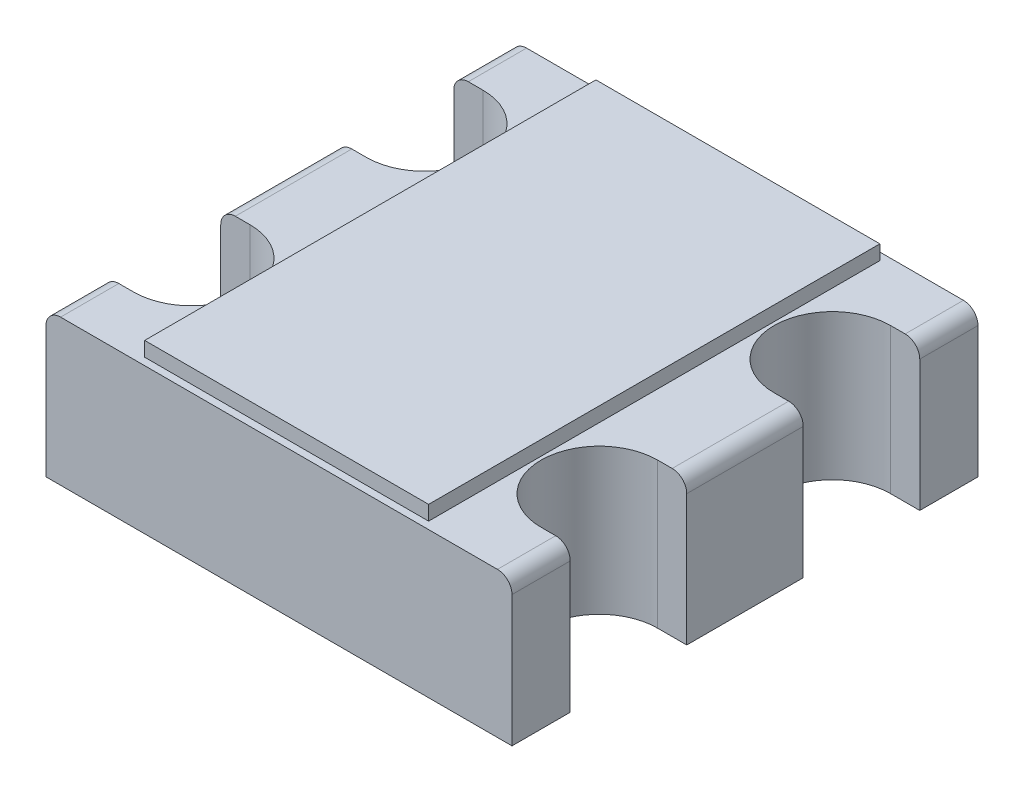
ISO-10303-21;
HEADER;
FILE_DESCRIPTION(('STEP AP214'),'2;1');
FILE_NAME('part.step','',(''),(''),'','','');
FILE_SCHEMA(('AUTOMOTIVE_DESIGN { 1 0 10303 214 1 1 1 1 }'));
ENDSEC;
DATA;
#1=APPLICATION_CONTEXT('core data for automotive mechanical design processes');
#2=APPLICATION_PROTOCOL_DEFINITION('international standard','automotive_design',2000,#1);
#3=PRODUCT_CONTEXT('',#1,'mechanical');
#4=PRODUCT('Part','Part','',(#3));
#5=PRODUCT_RELATED_PRODUCT_CATEGORY('part','',(#4));
#6=PRODUCT_DEFINITION_FORMATION('','',#4);
#7=PRODUCT_DEFINITION_CONTEXT('part definition',#1,'design');
#8=PRODUCT_DEFINITION('design','',#6,#7);
#9=PRODUCT_DEFINITION_SHAPE('','',#8);
#10=(LENGTH_UNIT() NAMED_UNIT(*) SI_UNIT(.MILLI.,.METRE.));
#11=(NAMED_UNIT(*) PLANE_ANGLE_UNIT() SI_UNIT($,.RADIAN.));
#12=(NAMED_UNIT(*) SI_UNIT($,.STERADIAN.) SOLID_ANGLE_UNIT());
#13=UNCERTAINTY_MEASURE_WITH_UNIT(LENGTH_MEASURE(1.E-05),#10,'distance_accuracy_value','');
#14=(GEOMETRIC_REPRESENTATION_CONTEXT(3) GLOBAL_UNCERTAINTY_ASSIGNED_CONTEXT((#13)) GLOBAL_UNIT_ASSIGNED_CONTEXT((#10,
#11,#12)) REPRESENTATION_CONTEXT('',''));
#15=CARTESIAN_POINT('',(0.,0.,0.));
#16=DIRECTION('',(0.,0.,1.));
#17=DIRECTION('',(1.,0.,0.));
#18=AXIS2_PLACEMENT_3D('',#15,#16,#17);
#19=CARTESIAN_POINT('',(-0.8,0.5,-0.8));
#20=DIRECTION('',(0.,0.,1.));
#21=DIRECTION('',(1.,0.,0.));
#22=AXIS2_PLACEMENT_3D('',#19,#20,#21);
#23=PLANE('',#22);
#24=DIRECTION('',(-1.,0.,0.));
#25=VECTOR('',#24,1.);
#26=CARTESIAN_POINT('',(-0.8,0.5,-0.8));
#27=LINE('',#26,#25);
#28=CARTESIAN_POINT('',(0.75,0.5,-0.8));
#29=VERTEX_POINT('',#28);
#30=CARTESIAN_POINT('',(-0.75,0.5,-0.8));
#31=VERTEX_POINT('',#30);
#32=EDGE_CURVE('E275',#29,#31,#27,.T.);
#33=ORIENTED_EDGE('',*,*,#32,.F.);
#34=CARTESIAN_POINT('',(0.75,0.45,-0.8));
#35=DIRECTION('',(0.,0.,1.));
#36=DIRECTION('',(1.,0.,0.));
#37=AXIS2_PLACEMENT_3D('',#34,#35,#36);
#38=CIRCLE('',#37,0.05);
#39=CARTESIAN_POINT('',(0.8,0.45,-0.8));
#40=VERTEX_POINT('',#39);
#41=EDGE_CURVE('E485',#29,#40,#38,.F.);
#42=ORIENTED_EDGE('',*,*,#41,.T.);
#43=DIRECTION('',(0.,-1.,0.));
#44=VECTOR('',#43,1.);
#45=CARTESIAN_POINT('',(0.8,0.5,-0.8));
#46=LINE('',#45,#44);
#47=CARTESIAN_POINT('',(0.8,0.,-0.8));
#48=VERTEX_POINT('',#47);
#49=EDGE_CURVE('E323',#40,#48,#46,.T.);
#50=ORIENTED_EDGE('',*,*,#49,.T.);
#51=DIRECTION('',(-1.,0.,0.));
#52=VECTOR('',#51,1.);
#53=CARTESIAN_POINT('',(-0.8,0.,-0.8));
#54=LINE('',#53,#52);
#55=CARTESIAN_POINT('',(-0.8,0.,-0.8));
#56=VERTEX_POINT('',#55);
#57=EDGE_CURVE('E264',#48,#56,#54,.T.);
#58=ORIENTED_EDGE('',*,*,#57,.T.);
#59=DIRECTION('',(0.,-1.,0.));
#60=VECTOR('',#59,1.);
#61=CARTESIAN_POINT('',(-0.8,0.5,-0.8));
#62=LINE('',#61,#60);
#63=CARTESIAN_POINT('',(-0.8,0.45,-0.8));
#64=VERTEX_POINT('',#63);
#65=EDGE_CURVE('E455',#64,#56,#62,.T.);
#66=ORIENTED_EDGE('',*,*,#65,.F.);
#67=CARTESIAN_POINT('',(-0.75,0.45,-0.8));
#68=DIRECTION('',(0.,0.,1.));
#69=DIRECTION('',(1.,0.,0.));
#70=AXIS2_PLACEMENT_3D('',#67,#68,#69);
#71=CIRCLE('',#70,0.05);
#72=EDGE_CURVE('E482',#64,#31,#71,.F.);
#73=ORIENTED_EDGE('',*,*,#72,.T.);
#74=EDGE_LOOP('',(#33,#42,#50,#58,#66,#73));
#75=FACE_BOUND('',#74,.T.);
#76=ADVANCED_FACE('F39',(#75),#23,.F.);
#77=CARTESIAN_POINT('',(-0.8,0.5,-0.8));
#78=DIRECTION('',(1.,0.,0.));
#79=DIRECTION('',(0.,0.,-1.));
#80=AXIS2_PLACEMENT_3D('',#77,#78,#79);
#81=PLANE('',#80);
#82=DIRECTION('',(0.,-1.,0.));
#83=VECTOR('',#82,1.);
#84=CARTESIAN_POINT('',(-0.8,0.5,-0.6));
#85=LINE('',#84,#83);
#86=CARTESIAN_POINT('',(-0.8,0.45,-0.6));
#87=VERTEX_POINT('',#86);
#88=CARTESIAN_POINT('',(-0.8,0.,-0.6));
#89=VERTEX_POINT('',#88);
#90=EDGE_CURVE('E452',#87,#89,#85,.T.);
#91=ORIENTED_EDGE('',*,*,#90,.F.);
#92=DIRECTION('',(0.,0.,1.));
#93=VECTOR('',#92,1.);
#94=CARTESIAN_POINT('',(-0.8,0.45,-0.8));
#95=LINE('',#94,#93);
#96=EDGE_CURVE('E11',#87,#64,#95,.F.);
#97=ORIENTED_EDGE('',*,*,#96,.T.);
#98=ORIENTED_EDGE('',*,*,#65,.T.);
#99=DIRECTION('',(0.,0.,1.));
#100=VECTOR('',#99,1.);
#101=CARTESIAN_POINT('',(-0.8,0.,-0.8));
#102=LINE('',#101,#100);
#103=EDGE_CURVE('E269',#56,#89,#102,.T.);
#104=ORIENTED_EDGE('',*,*,#103,.T.);
#105=EDGE_LOOP('',(#91,#97,#98,#104));
#106=FACE_BOUND('',#105,.T.);
#107=ADVANCED_FACE('F650',(#106),#81,.F.);
#108=CARTESIAN_POINT('',(-0.8,0.5,-0.6));
#109=DIRECTION('',(0.,0.,-1.));
#110=DIRECTION('',(-1.,0.,0.));
#111=AXIS2_PLACEMENT_3D('',#108,#109,#110);
#112=PLANE('',#111);
#113=DIRECTION('',(1.,0.,0.));
#114=VECTOR('',#113,1.);
#115=CARTESIAN_POINT('',(-0.8,0.5,-0.6));
#116=LINE('',#115,#114);
#117=CARTESIAN_POINT('',(-0.75,0.5,-0.6));
#118=VERTEX_POINT('',#117);
#119=CARTESIAN_POINT('',(-0.7,0.5,-0.6));
#120=VERTEX_POINT('',#119);
#121=EDGE_CURVE('E279',#118,#120,#116,.T.);
#122=ORIENTED_EDGE('',*,*,#121,.F.);
#123=CARTESIAN_POINT('',(-0.75,0.45,-0.6));
#124=DIRECTION('',(0.,0.,-1.));
#125=DIRECTION('',(-1.,0.,0.));
#126=AXIS2_PLACEMENT_3D('',#123,#124,#125);
#127=CIRCLE('',#126,0.05);
#128=EDGE_CURVE('E48',#118,#87,#127,.F.);
#129=ORIENTED_EDGE('',*,*,#128,.T.);
#130=ORIENTED_EDGE('',*,*,#90,.T.);
#131=DIRECTION('',(1.,0.,0.));
#132=VECTOR('',#131,1.);
#133=CARTESIAN_POINT('',(-0.8,0.,-0.6));
#134=LINE('',#133,#132);
#135=CARTESIAN_POINT('',(-0.7,0.,-0.6));
#136=VERTEX_POINT('',#135);
#137=EDGE_CURVE('E328',#89,#136,#134,.T.);
#138=ORIENTED_EDGE('',*,*,#137,.T.);
#139=DIRECTION('',(0.,-1.,0.));
#140=VECTOR('',#139,1.);
#141=CARTESIAN_POINT('',(-0.7,0.5,-0.6));
#142=LINE('',#141,#140);
#143=EDGE_CURVE('E448',#120,#136,#142,.T.);
#144=ORIENTED_EDGE('',*,*,#143,.F.);
#145=EDGE_LOOP('',(#122,#129,#130,#138,#144));
#146=FACE_BOUND('',#145,.T.);
#147=ADVANCED_FACE('F639',(#146),#112,.F.);
#148=CARTESIAN_POINT('',(-0.7,0.5,-0.4));
#149=DIRECTION('',(0.,-1.,0.));
#150=DIRECTION('',(0.,0.,-1.));
#151=AXIS2_PLACEMENT_3D('',#148,#149,#150);
#152=CYLINDRICAL_SURFACE('',#151,0.2);
#153=CARTESIAN_POINT('',(-0.7,0.,-0.4));
#154=DIRECTION('',(0.,-1.,0.));
#155=DIRECTION('',(0.,0.,-1.));
#156=AXIS2_PLACEMENT_3D('',#153,#154,#155);
#157=CIRCLE('',#156,0.2);
#158=CARTESIAN_POINT('',(-0.7,0.,-0.2));
#159=VERTEX_POINT('',#158);
#160=EDGE_CURVE('E331',#136,#159,#157,.T.);
#161=ORIENTED_EDGE('',*,*,#160,.T.);
#162=DIRECTION('',(0.,-1.,0.));
#163=VECTOR('',#162,1.);
#164=CARTESIAN_POINT('',(-0.7,0.5,-0.2));
#165=LINE('',#164,#163);
#166=CARTESIAN_POINT('',(-0.7,0.5,-0.2));
#167=VERTEX_POINT('',#166);
#168=EDGE_CURVE('E444',#167,#159,#165,.T.);
#169=ORIENTED_EDGE('',*,*,#168,.F.);
#170=CARTESIAN_POINT('',(-0.7,0.5,-0.4));
#171=DIRECTION('',(0.,-1.,0.));
#172=DIRECTION('',(0.,0.,-1.));
#173=AXIS2_PLACEMENT_3D('',#170,#171,#172);
#174=CIRCLE('',#173,0.2);
#175=EDGE_CURVE('E283',#120,#167,#174,.T.);
#176=ORIENTED_EDGE('',*,*,#175,.F.);
#177=ORIENTED_EDGE('',*,*,#143,.T.);
#178=EDGE_LOOP('',(#161,#169,#176,#177));
#179=FACE_BOUND('',#178,.T.);
#180=ADVANCED_FACE('F642',(#179),#152,.F.);
#181=CARTESIAN_POINT('',(-0.7,0.5,-0.2));
#182=DIRECTION('',(0.,0.,1.));
#183=DIRECTION('',(1.,0.,0.));
#184=AXIS2_PLACEMENT_3D('',#181,#182,#183);
#185=PLANE('',#184);
#186=DIRECTION('',(0.,-1.,0.));
#187=VECTOR('',#186,1.);
#188=CARTESIAN_POINT('',(-0.8,0.5,-0.2));
#189=LINE('',#188,#187);
#190=CARTESIAN_POINT('',(-0.8,0.45,-0.2));
#191=VERTEX_POINT('',#190);
#192=CARTESIAN_POINT('',(-0.8,0.,-0.2));
#193=VERTEX_POINT('',#192);
#194=EDGE_CURVE('E441',#191,#193,#189,.T.);
#195=ORIENTED_EDGE('',*,*,#194,.F.);
#196=CARTESIAN_POINT('',(-0.75,0.45,-0.2));
#197=DIRECTION('',(0.,0.,1.));
#198=DIRECTION('',(1.,0.,0.));
#199=AXIS2_PLACEMENT_3D('',#196,#197,#198);
#200=CIRCLE('',#199,0.05);
#201=CARTESIAN_POINT('',(-0.75,0.5,-0.2));
#202=VERTEX_POINT('',#201);
#203=EDGE_CURVE('E526',#191,#202,#200,.F.);
#204=ORIENTED_EDGE('',*,*,#203,.T.);
#205=DIRECTION('',(-1.,0.,0.));
#206=VECTOR('',#205,1.);
#207=CARTESIAN_POINT('',(-0.7,0.5,-0.2));
#208=LINE('',#207,#206);
#209=EDGE_CURVE('E286',#167,#202,#208,.T.);
#210=ORIENTED_EDGE('',*,*,#209,.F.);
#211=ORIENTED_EDGE('',*,*,#168,.T.);
#212=DIRECTION('',(-1.,0.,0.));
#213=VECTOR('',#212,1.);
#214=CARTESIAN_POINT('',(-0.7,0.,-0.2));
#215=LINE('',#214,#213);
#216=EDGE_CURVE('E334',#159,#193,#215,.T.);
#217=ORIENTED_EDGE('',*,*,#216,.T.);
#218=EDGE_LOOP('',(#195,#204,#210,#211,#217));
#219=FACE_BOUND('',#218,.T.);
#220=ADVANCED_FACE('F532',(#219),#185,.F.);
#221=CARTESIAN_POINT('',(-0.8,0.5,-0.2));
#222=DIRECTION('',(1.,0.,0.));
#223=DIRECTION('',(0.,0.,-1.));
#224=AXIS2_PLACEMENT_3D('',#221,#222,#223);
#225=PLANE('',#224);
#226=DIRECTION('',(0.,-1.,0.));
#227=VECTOR('',#226,1.);
#228=CARTESIAN_POINT('',(-0.800000000000001,0.5,0.2));
#229=LINE('',#228,#227);
#230=CARTESIAN_POINT('',(-0.800000000000001,0.45,0.2));
#231=VERTEX_POINT('',#230);
#232=CARTESIAN_POINT('',(-0.800000000000001,0.,0.2));
#233=VERTEX_POINT('',#232);
#234=EDGE_CURVE('E438',#231,#233,#229,.T.);
#235=ORIENTED_EDGE('',*,*,#234,.F.);
#236=DIRECTION('',(0.,0.,1.));
#237=VECTOR('',#236,1.);
#238=CARTESIAN_POINT('',(-0.8,0.45,-0.2));
#239=LINE('',#238,#237);
#240=EDGE_CURVE('E62',#231,#191,#239,.F.);
#241=ORIENTED_EDGE('',*,*,#240,.T.);
#242=ORIENTED_EDGE('',*,*,#194,.T.);
#243=DIRECTION('',(0.,0.,1.));
#244=VECTOR('',#243,1.);
#245=CARTESIAN_POINT('',(-0.8,0.,-0.2));
#246=LINE('',#245,#244);
#247=EDGE_CURVE('E338',#193,#233,#246,.T.);
#248=ORIENTED_EDGE('',*,*,#247,.T.);
#249=EDGE_LOOP('',(#235,#241,#242,#248));
#250=FACE_BOUND('',#249,.T.);
#251=ADVANCED_FACE('F544',(#250),#225,.F.);
#252=CARTESIAN_POINT('',(-0.700000000000001,0.5,0.2));
#253=DIRECTION('',(0.,0.,-1.));
#254=DIRECTION('',(-1.,0.,0.));
#255=AXIS2_PLACEMENT_3D('',#252,#253,#254);
#256=PLANE('',#255);
#257=DIRECTION('',(1.,0.,0.));
#258=VECTOR('',#257,1.);
#259=CARTESIAN_POINT('',(-0.700000000000001,0.5,0.2));
#260=LINE('',#259,#258);
#261=CARTESIAN_POINT('',(-0.75,0.5,0.2));
#262=VERTEX_POINT('',#261);
#263=CARTESIAN_POINT('',(-0.700000000000001,0.5,0.2));
#264=VERTEX_POINT('',#263);
#265=EDGE_CURVE('E290',#262,#264,#260,.T.);
#266=ORIENTED_EDGE('',*,*,#265,.F.);
#267=CARTESIAN_POINT('',(-0.75,0.45,0.2));
#268=DIRECTION('',(0.,0.,-1.));
#269=DIRECTION('',(-1.,0.,0.));
#270=AXIS2_PLACEMENT_3D('',#267,#268,#269);
#271=CIRCLE('',#270,0.05);
#272=EDGE_CURVE('E521',#262,#231,#271,.F.);
#273=ORIENTED_EDGE('',*,*,#272,.T.);
#274=ORIENTED_EDGE('',*,*,#234,.T.);
#275=DIRECTION('',(1.,0.,0.));
#276=VECTOR('',#275,1.);
#277=CARTESIAN_POINT('',(-0.700000000000001,0.,0.2));
#278=LINE('',#277,#276);
#279=CARTESIAN_POINT('',(-0.700000000000001,0.,0.2));
#280=VERTEX_POINT('',#279);
#281=EDGE_CURVE('E342',#233,#280,#278,.T.);
#282=ORIENTED_EDGE('',*,*,#281,.T.);
#283=DIRECTION('',(0.,-1.,0.));
#284=VECTOR('',#283,1.);
#285=CARTESIAN_POINT('',(-0.700000000000001,0.5,0.2));
#286=LINE('',#285,#284);
#287=EDGE_CURVE('E434',#264,#280,#286,.T.);
#288=ORIENTED_EDGE('',*,*,#287,.F.);
#289=EDGE_LOOP('',(#266,#273,#274,#282,#288));
#290=FACE_BOUND('',#289,.T.);
#291=ADVANCED_FACE('F542',(#290),#256,.F.);
#292=CARTESIAN_POINT('',(-0.700000000000001,0.5,0.4));
#293=DIRECTION('',(0.,-1.,0.));
#294=DIRECTION('',(0.,0.,-1.));
#295=AXIS2_PLACEMENT_3D('',#292,#293,#294);
#296=CYLINDRICAL_SURFACE('',#295,0.2);
#297=CARTESIAN_POINT('',(-0.700000000000001,0.,0.4));
#298=DIRECTION('',(0.,-1.,0.));
#299=DIRECTION('',(0.,0.,1.));
#300=AXIS2_PLACEMENT_3D('',#297,#298,#299);
#301=CIRCLE('',#300,0.2);
#302=CARTESIAN_POINT('',(-0.700000000000001,0.,0.6));
#303=VERTEX_POINT('',#302);
#304=EDGE_CURVE('E345',#280,#303,#301,.T.);
#305=ORIENTED_EDGE('',*,*,#304,.T.);
#306=DIRECTION('',(0.,-1.,0.));
#307=VECTOR('',#306,1.);
#308=CARTESIAN_POINT('',(-0.700000000000001,0.5,0.6));
#309=LINE('',#308,#307);
#310=CARTESIAN_POINT('',(-0.700000000000001,0.5,0.6));
#311=VERTEX_POINT('',#310);
#312=EDGE_CURVE('E430',#311,#303,#309,.T.);
#313=ORIENTED_EDGE('',*,*,#312,.F.);
#314=CARTESIAN_POINT('',(-0.700000000000001,0.5,0.4));
#315=DIRECTION('',(0.,-1.,0.));
#316=DIRECTION('',(0.,0.,1.));
#317=AXIS2_PLACEMENT_3D('',#314,#315,#316);
#318=CIRCLE('',#317,0.2);
#319=EDGE_CURVE('E293',#264,#311,#318,.T.);
#320=ORIENTED_EDGE('',*,*,#319,.F.);
#321=ORIENTED_EDGE('',*,*,#287,.T.);
#322=EDGE_LOOP('',(#305,#313,#320,#321));
#323=FACE_BOUND('',#322,.T.);
#324=ADVANCED_FACE('F555',(#323),#296,.F.);
#325=CARTESIAN_POINT('',(-0.800000000000001,0.5,0.6));
#326=DIRECTION('',(0.,0.,1.));
#327=DIRECTION('',(1.,0.,0.));
#328=AXIS2_PLACEMENT_3D('',#325,#326,#327);
#329=PLANE('',#328);
#330=DIRECTION('',(0.,-1.,0.));
#331=VECTOR('',#330,1.);
#332=CARTESIAN_POINT('',(-0.800000000000001,0.5,0.6));
#333=LINE('',#332,#331);
#334=CARTESIAN_POINT('',(-0.800000000000001,0.45,0.6));
#335=VERTEX_POINT('',#334);
#336=CARTESIAN_POINT('',(-0.800000000000001,0.,0.6));
#337=VERTEX_POINT('',#336);
#338=EDGE_CURVE('E427',#335,#337,#333,.T.);
#339=ORIENTED_EDGE('',*,*,#338,.F.);
#340=CARTESIAN_POINT('',(-0.750000000000001,0.45,0.6));
#341=DIRECTION('',(0.,0.,1.));
#342=DIRECTION('',(1.,0.,0.));
#343=AXIS2_PLACEMENT_3D('',#340,#341,#342);
#344=CIRCLE('',#343,0.05);
#345=CARTESIAN_POINT('',(-0.750000000000001,0.5,0.6));
#346=VERTEX_POINT('',#345);
#347=EDGE_CURVE('E518',#335,#346,#344,.F.);
#348=ORIENTED_EDGE('',*,*,#347,.T.);
#349=DIRECTION('',(-1.,0.,0.));
#350=VECTOR('',#349,1.);
#351=CARTESIAN_POINT('',(-0.800000000000001,0.5,0.6));
#352=LINE('',#351,#350);
#353=EDGE_CURVE('E296',#311,#346,#352,.T.);
#354=ORIENTED_EDGE('',*,*,#353,.F.);
#355=ORIENTED_EDGE('',*,*,#312,.T.);
#356=DIRECTION('',(-1.,0.,0.));
#357=VECTOR('',#356,1.);
#358=CARTESIAN_POINT('',(-0.800000000000001,0.,0.6));
#359=LINE('',#358,#357);
#360=EDGE_CURVE('E348',#303,#337,#359,.T.);
#361=ORIENTED_EDGE('',*,*,#360,.T.);
#362=EDGE_LOOP('',(#339,#348,#354,#355,#361));
#363=FACE_BOUND('',#362,.T.);
#364=ADVANCED_FACE('F793',(#363),#329,.F.);
#365=CARTESIAN_POINT('',(-0.800000000000001,0.5,0.8));
#366=DIRECTION('',(1.,0.,0.));
#367=DIRECTION('',(0.,0.,-1.));
#368=AXIS2_PLACEMENT_3D('',#365,#366,#367);
#369=PLANE('',#368);
#370=DIRECTION('',(0.,-1.,0.));
#371=VECTOR('',#370,1.);
#372=CARTESIAN_POINT('',(-0.800000000000001,0.5,0.8));
#373=LINE('',#372,#371);
#374=CARTESIAN_POINT('',(-0.800000000000001,0.45,0.8));
#375=VERTEX_POINT('',#374);
#376=CARTESIAN_POINT('',(-0.800000000000001,0.,0.8));
#377=VERTEX_POINT('',#376);
#378=EDGE_CURVE('E424',#375,#377,#373,.T.);
#379=ORIENTED_EDGE('',*,*,#378,.F.);
#380=DIRECTION('',(0.,0.,1.));
#381=VECTOR('',#380,1.);
#382=CARTESIAN_POINT('',(-0.800000000000001,0.45,0.6));
#383=LINE('',#382,#381);
#384=EDGE_CURVE('E515',#375,#335,#383,.F.);
#385=ORIENTED_EDGE('',*,*,#384,.T.);
#386=ORIENTED_EDGE('',*,*,#338,.T.);
#387=DIRECTION('',(0.,0.,1.));
#388=VECTOR('',#387,1.);
#389=CARTESIAN_POINT('',(-0.800000000000001,0.,0.8));
#390=LINE('',#389,#388);
#391=EDGE_CURVE('E352',#337,#377,#390,.T.);
#392=ORIENTED_EDGE('',*,*,#391,.T.);
#393=EDGE_LOOP('',(#379,#385,#386,#392));
#394=FACE_BOUND('',#393,.T.);
#395=ADVANCED_FACE('F570',(#394),#369,.F.);
#396=CARTESIAN_POINT('',(-0.800000000000001,0.5,0.8));
#397=DIRECTION('',(0.,0.,-1.));
#398=DIRECTION('',(-1.,0.,0.));
#399=AXIS2_PLACEMENT_3D('',#396,#397,#398);
#400=PLANE('',#399);
#401=DIRECTION('',(0.,-1.,0.));
#402=VECTOR('',#401,1.);
#403=CARTESIAN_POINT('',(0.799999999999998,0.5,0.8));
#404=LINE('',#403,#402);
#405=CARTESIAN_POINT('',(0.799999999999998,0.45,0.8));
#406=VERTEX_POINT('',#405);
#407=CARTESIAN_POINT('',(0.799999999999998,0.,0.8));
#408=VERTEX_POINT('',#407);
#409=EDGE_CURVE('E421',#406,#408,#404,.T.);
#410=ORIENTED_EDGE('',*,*,#409,.F.);
#411=CARTESIAN_POINT('',(0.749999999999998,0.45,0.8));
#412=DIRECTION('',(0.,0.,-1.));
#413=DIRECTION('',(-1.,0.,0.));
#414=AXIS2_PLACEMENT_3D('',#411,#412,#413);
#415=CIRCLE('',#414,0.05);
#416=CARTESIAN_POINT('',(0.749999999999998,0.5,0.8));
#417=VERTEX_POINT('',#416);
#418=EDGE_CURVE('E512',#406,#417,#415,.F.);
#419=ORIENTED_EDGE('',*,*,#418,.T.);
#420=DIRECTION('',(1.,0.,0.));
#421=VECTOR('',#420,1.);
#422=CARTESIAN_POINT('',(-0.800000000000001,0.5,0.8));
#423=LINE('',#422,#421);
#424=CARTESIAN_POINT('',(-0.750000000000001,0.5,0.8));
#425=VERTEX_POINT('',#424);
#426=EDGE_CURVE('E300',#425,#417,#423,.T.);
#427=ORIENTED_EDGE('',*,*,#426,.F.);
#428=CARTESIAN_POINT('',(-0.750000000000001,0.45,0.8));
#429=DIRECTION('',(0.,0.,-1.));
#430=DIRECTION('',(-1.,0.,0.));
#431=AXIS2_PLACEMENT_3D('',#428,#429,#430);
#432=CIRCLE('',#431,0.05);
#433=EDGE_CURVE('E509',#425,#375,#432,.F.);
#434=ORIENTED_EDGE('',*,*,#433,.T.);
#435=ORIENTED_EDGE('',*,*,#378,.T.);
#436=DIRECTION('',(1.,0.,0.));
#437=VECTOR('',#436,1.);
#438=CARTESIAN_POINT('',(-0.800000000000001,0.,0.8));
#439=LINE('',#438,#437);
#440=EDGE_CURVE('E356',#377,#408,#439,.T.);
#441=ORIENTED_EDGE('',*,*,#440,.T.);
#442=EDGE_LOOP('',(#410,#419,#427,#434,#435,#441));
#443=FACE_BOUND('',#442,.T.);
#444=ADVANCED_FACE('F568',(#443),#400,.F.);
#445=CARTESIAN_POINT('',(0.799999999999998,0.5,0.8));
#446=DIRECTION('',(-1.,0.,0.));
#447=DIRECTION('',(0.,0.,1.));
#448=AXIS2_PLACEMENT_3D('',#445,#446,#447);
#449=PLANE('',#448);
#450=DIRECTION('',(0.,-1.,0.));
#451=VECTOR('',#450,1.);
#452=CARTESIAN_POINT('',(0.799999999999998,0.5,0.6));
#453=LINE('',#452,#451);
#454=CARTESIAN_POINT('',(0.799999999999998,0.45,0.6));
#455=VERTEX_POINT('',#454);
#456=CARTESIAN_POINT('',(0.799999999999998,0.,0.6));
#457=VERTEX_POINT('',#456);
#458=EDGE_CURVE('E418',#455,#457,#453,.T.);
#459=ORIENTED_EDGE('',*,*,#458,.F.);
#460=DIRECTION('',(0.,0.,-1.));
#461=VECTOR('',#460,1.);
#462=CARTESIAN_POINT('',(0.799999999999998,0.45,0.8));
#463=LINE('',#462,#461);
#464=EDGE_CURVE('E506',#455,#406,#463,.F.);
#465=ORIENTED_EDGE('',*,*,#464,.T.);
#466=ORIENTED_EDGE('',*,*,#409,.T.);
#467=DIRECTION('',(0.,0.,-1.));
#468=VECTOR('',#467,1.);
#469=CARTESIAN_POINT('',(0.799999999999998,0.,0.8));
#470=LINE('',#469,#468);
#471=EDGE_CURVE('E360',#408,#457,#470,.T.);
#472=ORIENTED_EDGE('',*,*,#471,.T.);
#473=EDGE_LOOP('',(#459,#465,#466,#472));
#474=FACE_BOUND('',#473,.T.);
#475=ADVANCED_FACE('F768',(#474),#449,.F.);
#476=CARTESIAN_POINT('',(0.799999999999998,0.5,0.6));
#477=DIRECTION('',(0.,0.,1.));
#478=DIRECTION('',(1.,0.,0.));
#479=AXIS2_PLACEMENT_3D('',#476,#477,#478);
#480=PLANE('',#479);
#481=DIRECTION('',(-1.,0.,0.));
#482=VECTOR('',#481,1.);
#483=CARTESIAN_POINT('',(0.799999999999998,0.5,0.6));
#484=LINE('',#483,#482);
#485=CARTESIAN_POINT('',(0.749999999999998,0.5,0.6));
#486=VERTEX_POINT('',#485);
#487=CARTESIAN_POINT('',(0.699999999999998,0.5,0.6));
#488=VERTEX_POINT('',#487);
#489=EDGE_CURVE('E304',#486,#488,#484,.T.);
#490=ORIENTED_EDGE('',*,*,#489,.F.);
#491=CARTESIAN_POINT('',(0.749999999999998,0.45,0.6));
#492=DIRECTION('',(0.,0.,1.));
#493=DIRECTION('',(1.,0.,0.));
#494=AXIS2_PLACEMENT_3D('',#491,#492,#493);
#495=CIRCLE('',#494,0.05);
#496=EDGE_CURVE('E503',#486,#455,#495,.F.);
#497=ORIENTED_EDGE('',*,*,#496,.T.);
#498=ORIENTED_EDGE('',*,*,#458,.T.);
#499=DIRECTION('',(-1.,0.,0.));
#500=VECTOR('',#499,1.);
#501=CARTESIAN_POINT('',(0.799999999999998,0.,0.6));
#502=LINE('',#501,#500);
#503=CARTESIAN_POINT('',(0.699999999999998,0.,0.6));
#504=VERTEX_POINT('',#503);
#505=EDGE_CURVE('E364',#457,#504,#502,.T.);
#506=ORIENTED_EDGE('',*,*,#505,.T.);
#507=DIRECTION('',(0.,-1.,0.));
#508=VECTOR('',#507,1.);
#509=CARTESIAN_POINT('',(0.699999999999998,0.5,0.6));
#510=LINE('',#509,#508);
#511=EDGE_CURVE('E414',#488,#504,#510,.T.);
#512=ORIENTED_EDGE('',*,*,#511,.F.);
#513=EDGE_LOOP('',(#490,#497,#498,#506,#512));
#514=FACE_BOUND('',#513,.T.);
#515=ADVANCED_FACE('F585',(#514),#480,.F.);
#516=CARTESIAN_POINT('',(0.699999999999998,0.5,0.4));
#517=DIRECTION('',(0.,-1.,0.));
#518=DIRECTION('',(0.,0.,-1.));
#519=AXIS2_PLACEMENT_3D('',#516,#517,#518);
#520=CYLINDRICAL_SURFACE('',#519,0.2);
#521=CARTESIAN_POINT('',(0.699999999999998,0.,0.4));
#522=DIRECTION('',(0.,-1.,0.));
#523=DIRECTION('',(0.,0.,-1.));
#524=AXIS2_PLACEMENT_3D('',#521,#522,#523);
#525=CIRCLE('',#524,0.2);
#526=CARTESIAN_POINT('',(0.699999999999998,0.,0.2));
#527=VERTEX_POINT('',#526);
#528=EDGE_CURVE('E367',#504,#527,#525,.T.);
#529=ORIENTED_EDGE('',*,*,#528,.T.);
#530=DIRECTION('',(0.,-1.,0.));
#531=VECTOR('',#530,1.);
#532=CARTESIAN_POINT('',(0.699999999999998,0.5,0.2));
#533=LINE('',#532,#531);
#534=CARTESIAN_POINT('',(0.699999999999998,0.5,0.2));
#535=VERTEX_POINT('',#534);
#536=EDGE_CURVE('E410',#535,#527,#533,.T.);
#537=ORIENTED_EDGE('',*,*,#536,.F.);
#538=CARTESIAN_POINT('',(0.699999999999998,0.5,0.4));
#539=DIRECTION('',(0.,-1.,0.));
#540=DIRECTION('',(0.,0.,-1.));
#541=AXIS2_PLACEMENT_3D('',#538,#539,#540);
#542=CIRCLE('',#541,0.2);
#543=EDGE_CURVE('E307',#488,#535,#542,.T.);
#544=ORIENTED_EDGE('',*,*,#543,.F.);
#545=ORIENTED_EDGE('',*,*,#511,.T.);
#546=EDGE_LOOP('',(#529,#537,#544,#545));
#547=FACE_BOUND('',#546,.T.);
#548=ADVANCED_FACE('F591',(#547),#520,.F.);
#549=CARTESIAN_POINT('',(0.699999999999998,0.5,0.2));
#550=DIRECTION('',(0.,0.,-1.));
#551=DIRECTION('',(-1.,0.,0.));
#552=AXIS2_PLACEMENT_3D('',#549,#550,#551);
#553=PLANE('',#552);
#554=DIRECTION('',(0.,-1.,0.));
#555=VECTOR('',#554,1.);
#556=CARTESIAN_POINT('',(0.799999999999998,0.5,0.2));
#557=LINE('',#556,#555);
#558=CARTESIAN_POINT('',(0.799999999999998,0.45,0.2));
#559=VERTEX_POINT('',#558);
#560=CARTESIAN_POINT('',(0.799999999999998,0.,0.2));
#561=VERTEX_POINT('',#560);
#562=EDGE_CURVE('E407',#559,#561,#557,.T.);
#563=ORIENTED_EDGE('',*,*,#562,.F.);
#564=CARTESIAN_POINT('',(0.749999999999998,0.45,0.2));
#565=DIRECTION('',(0.,0.,-1.));
#566=DIRECTION('',(-1.,0.,0.));
#567=AXIS2_PLACEMENT_3D('',#564,#565,#566);
#568=CIRCLE('',#567,0.05);
#569=CARTESIAN_POINT('',(0.749999999999998,0.5,0.2));
#570=VERTEX_POINT('',#569);
#571=EDGE_CURVE('E500',#559,#570,#568,.F.);
#572=ORIENTED_EDGE('',*,*,#571,.T.);
#573=DIRECTION('',(1.,0.,0.));
#574=VECTOR('',#573,1.);
#575=CARTESIAN_POINT('',(0.699999999999998,0.5,0.2));
#576=LINE('',#575,#574);
#577=EDGE_CURVE('E310',#535,#570,#576,.T.);
#578=ORIENTED_EDGE('',*,*,#577,.F.);
#579=ORIENTED_EDGE('',*,*,#536,.T.);
#580=DIRECTION('',(1.,0.,0.));
#581=VECTOR('',#580,1.);
#582=CARTESIAN_POINT('',(0.699999999999998,0.,0.2));
#583=LINE('',#582,#581);
#584=EDGE_CURVE('E370',#527,#561,#583,.T.);
#585=ORIENTED_EDGE('',*,*,#584,.T.);
#586=EDGE_LOOP('',(#563,#572,#578,#579,#585));
#587=FACE_BOUND('',#586,.T.);
#588=ADVANCED_FACE('F749',(#587),#553,.F.);
#589=CARTESIAN_POINT('',(0.8,0.5,-0.2));
#590=DIRECTION('',(-1.,0.,0.));
#591=DIRECTION('',(0.,0.,1.));
#592=AXIS2_PLACEMENT_3D('',#589,#590,#591);
#593=PLANE('',#592);
#594=DIRECTION('',(0.,-1.,0.));
#595=VECTOR('',#594,1.);
#596=CARTESIAN_POINT('',(0.8,0.5,-0.2));
#597=LINE('',#596,#595);
#598=CARTESIAN_POINT('',(0.8,0.45,-0.2));
#599=VERTEX_POINT('',#598);
#600=CARTESIAN_POINT('',(0.8,0.,-0.2));
#601=VERTEX_POINT('',#600);
#602=EDGE_CURVE('E404',#599,#601,#597,.T.);
#603=ORIENTED_EDGE('',*,*,#602,.F.);
#604=DIRECTION('',(0.,0.,-1.));
#605=VECTOR('',#604,1.);
#606=CARTESIAN_POINT('',(0.799999999999998,0.45,0.2));
#607=LINE('',#606,#605);
#608=EDGE_CURVE('E497',#599,#559,#607,.F.);
#609=ORIENTED_EDGE('',*,*,#608,.T.);
#610=ORIENTED_EDGE('',*,*,#562,.T.);
#611=DIRECTION('',(0.,0.,-1.));
#612=VECTOR('',#611,1.);
#613=CARTESIAN_POINT('',(0.8,0.,-0.2));
#614=LINE('',#613,#612);
#615=EDGE_CURVE('E374',#561,#601,#614,.T.);
#616=ORIENTED_EDGE('',*,*,#615,.T.);
#617=EDGE_LOOP('',(#603,#609,#610,#616));
#618=FACE_BOUND('',#617,.T.);
#619=ADVANCED_FACE('F605',(#618),#593,.F.);
#620=CARTESIAN_POINT('',(0.7,0.5,-0.2));
#621=DIRECTION('',(0.,0.,1.));
#622=DIRECTION('',(1.,0.,0.));
#623=AXIS2_PLACEMENT_3D('',#620,#621,#622);
#624=PLANE('',#623);
#625=DIRECTION('',(-1.,0.,0.));
#626=VECTOR('',#625,1.);
#627=CARTESIAN_POINT('',(0.7,0.5,-0.2));
#628=LINE('',#627,#626);
#629=CARTESIAN_POINT('',(0.75,0.5,-0.2));
#630=VERTEX_POINT('',#629);
#631=CARTESIAN_POINT('',(0.7,0.5,-0.2));
#632=VERTEX_POINT('',#631);
#633=EDGE_CURVE('E314',#630,#632,#628,.T.);
#634=ORIENTED_EDGE('',*,*,#633,.F.);
#635=CARTESIAN_POINT('',(0.75,0.45,-0.2));
#636=DIRECTION('',(0.,0.,1.));
#637=DIRECTION('',(1.,0.,0.));
#638=AXIS2_PLACEMENT_3D('',#635,#636,#637);
#639=CIRCLE('',#638,0.05);
#640=EDGE_CURVE('E494',#630,#599,#639,.F.);
#641=ORIENTED_EDGE('',*,*,#640,.T.);
#642=ORIENTED_EDGE('',*,*,#602,.T.);
#643=DIRECTION('',(-1.,0.,0.));
#644=VECTOR('',#643,1.);
#645=CARTESIAN_POINT('',(0.7,0.,-0.2));
#646=LINE('',#645,#644);
#647=CARTESIAN_POINT('',(0.7,0.,-0.2));
#648=VERTEX_POINT('',#647);
#649=EDGE_CURVE('E378',#601,#648,#646,.T.);
#650=ORIENTED_EDGE('',*,*,#649,.T.);
#651=DIRECTION('',(0.,-1.,0.));
#652=VECTOR('',#651,1.);
#653=CARTESIAN_POINT('',(0.7,0.5,-0.2));
#654=LINE('',#653,#652);
#655=EDGE_CURVE('E400',#632,#648,#654,.T.);
#656=ORIENTED_EDGE('',*,*,#655,.F.);
#657=EDGE_LOOP('',(#634,#641,#642,#650,#656));
#658=FACE_BOUND('',#657,.T.);
#659=ADVANCED_FACE('F602',(#658),#624,.F.);
#660=CARTESIAN_POINT('',(0.7,0.5,-0.4));
#661=DIRECTION('',(0.,-1.,0.));
#662=DIRECTION('',(0.,0.,-1.));
#663=AXIS2_PLACEMENT_3D('',#660,#661,#662);
#664=CYLINDRICAL_SURFACE('',#663,0.2);
#665=CARTESIAN_POINT('',(0.7,0.,-0.4));
#666=DIRECTION('',(0.,-1.,0.));
#667=DIRECTION('',(0.,0.,1.));
#668=AXIS2_PLACEMENT_3D('',#665,#666,#667);
#669=CIRCLE('',#668,0.2);
#670=CARTESIAN_POINT('',(0.7,0.,-0.6));
#671=VERTEX_POINT('',#670);
#672=EDGE_CURVE('E381',#648,#671,#669,.T.);
#673=ORIENTED_EDGE('',*,*,#672,.T.);
#674=DIRECTION('',(0.,-1.,0.));
#675=VECTOR('',#674,1.);
#676=CARTESIAN_POINT('',(0.7,0.5,-0.6));
#677=LINE('',#676,#675);
#678=CARTESIAN_POINT('',(0.7,0.5,-0.6));
#679=VERTEX_POINT('',#678);
#680=EDGE_CURVE('E396',#679,#671,#677,.T.);
#681=ORIENTED_EDGE('',*,*,#680,.F.);
#682=CARTESIAN_POINT('',(0.7,0.5,-0.4));
#683=DIRECTION('',(0.,-1.,0.));
#684=DIRECTION('',(0.,0.,1.));
#685=AXIS2_PLACEMENT_3D('',#682,#683,#684);
#686=CIRCLE('',#685,0.2);
#687=EDGE_CURVE('E317',#632,#679,#686,.T.);
#688=ORIENTED_EDGE('',*,*,#687,.F.);
#689=ORIENTED_EDGE('',*,*,#655,.T.);
#690=EDGE_LOOP('',(#673,#681,#688,#689));
#691=FACE_BOUND('',#690,.T.);
#692=ADVANCED_FACE('F614',(#691),#664,.F.);
#693=CARTESIAN_POINT('',(0.8,0.5,-0.6));
#694=DIRECTION('',(0.,0.,-1.));
#695=DIRECTION('',(-1.,0.,0.));
#696=AXIS2_PLACEMENT_3D('',#693,#694,#695);
#697=PLANE('',#696);
#698=DIRECTION('',(0.,-1.,0.));
#699=VECTOR('',#698,1.);
#700=CARTESIAN_POINT('',(0.8,0.5,-0.6));
#701=LINE('',#700,#699);
#702=CARTESIAN_POINT('',(0.8,0.45,-0.6));
#703=VERTEX_POINT('',#702);
#704=CARTESIAN_POINT('',(0.8,0.,-0.6));
#705=VERTEX_POINT('',#704);
#706=EDGE_CURVE('E393',#703,#705,#701,.T.);
#707=ORIENTED_EDGE('',*,*,#706,.F.);
#708=CARTESIAN_POINT('',(0.75,0.45,-0.6));
#709=DIRECTION('',(0.,0.,-1.));
#710=DIRECTION('',(-1.,0.,0.));
#711=AXIS2_PLACEMENT_3D('',#708,#709,#710);
#712=CIRCLE('',#711,0.05);
#713=CARTESIAN_POINT('',(0.75,0.5,-0.6));
#714=VERTEX_POINT('',#713);
#715=EDGE_CURVE('E491',#703,#714,#712,.F.);
#716=ORIENTED_EDGE('',*,*,#715,.T.);
#717=DIRECTION('',(1.,0.,0.));
#718=VECTOR('',#717,1.);
#719=CARTESIAN_POINT('',(0.8,0.5,-0.6));
#720=LINE('',#719,#718);
#721=EDGE_CURVE('E320',#679,#714,#720,.T.);
#722=ORIENTED_EDGE('',*,*,#721,.F.);
#723=ORIENTED_EDGE('',*,*,#680,.T.);
#724=DIRECTION('',(1.,0.,0.));
#725=VECTOR('',#724,1.);
#726=CARTESIAN_POINT('',(0.8,0.,-0.6));
#727=LINE('',#726,#725);
#728=EDGE_CURVE('E384',#671,#705,#727,.T.);
#729=ORIENTED_EDGE('',*,*,#728,.T.);
#730=EDGE_LOOP('',(#707,#716,#722,#723,#729));
#731=FACE_BOUND('',#730,.T.);
#732=ADVANCED_FACE('F722',(#731),#697,.F.);
#733=CARTESIAN_POINT('',(0.8,0.5,-0.8));
#734=DIRECTION('',(-1.,0.,0.));
#735=DIRECTION('',(0.,0.,1.));
#736=AXIS2_PLACEMENT_3D('',#733,#734,#735);
#737=PLANE('',#736);
#738=ORIENTED_EDGE('',*,*,#49,.F.);
#739=DIRECTION('',(0.,0.,-1.));
#740=VECTOR('',#739,1.);
#741=CARTESIAN_POINT('',(0.8,0.45,-0.6));
#742=LINE('',#741,#740);
#743=EDGE_CURVE('E488',#40,#703,#742,.F.);
#744=ORIENTED_EDGE('',*,*,#743,.T.);
#745=ORIENTED_EDGE('',*,*,#706,.T.);
#746=DIRECTION('',(0.,0.,-1.));
#747=VECTOR('',#746,1.);
#748=CARTESIAN_POINT('',(0.8,0.,-0.8));
#749=LINE('',#748,#747);
#750=EDGE_CURVE('E280',#705,#48,#749,.T.);
#751=ORIENTED_EDGE('',*,*,#750,.T.);
#752=EDGE_LOOP('',(#738,#744,#745,#751));
#753=FACE_BOUND('',#752,.T.);
#754=ADVANCED_FACE('F627',(#753),#737,.F.);
#755=CARTESIAN_POINT('',(0.7,0.5,-0.4));
#756=DIRECTION('',(0.,1.,0.));
#757=DIRECTION('',(0.,0.,1.));
#758=AXIS2_PLACEMENT_3D('',#755,#756,#757);
#759=PLANE('',#758);
#760=DIRECTION('',(0.,0.,1.));
#761=VECTOR('',#760,1.);
#762=CARTESIAN_POINT('',(-0.486394189587192,0.5,0.774847684420061));
#763=LINE('',#762,#761);
#764=CARTESIAN_POINT('',(-0.486394189587192,0.5,-0.774481650322502));
#765=VERTEX_POINT('',#764);
#766=CARTESIAN_POINT('',(-0.486394189587192,0.5,0.774847684420061));
#767=VERTEX_POINT('',#766);
#768=EDGE_CURVE('E262',#765,#767,#763,.T.);
#769=ORIENTED_EDGE('',*,*,#768,.F.);
#770=DIRECTION('',(-1.,0.,0.));
#771=VECTOR('',#770,1.);
#772=CARTESIAN_POINT('',(-0.486394189587192,0.5,-0.774481650322502));
#773=LINE('',#772,#771);
#774=CARTESIAN_POINT('',(0.488571441817604,0.5,-0.774481650322502));
#775=VERTEX_POINT('',#774);
#776=EDGE_CURVE('E259',#775,#765,#773,.T.);
#777=ORIENTED_EDGE('',*,*,#776,.F.);
#778=DIRECTION('',(0.,0.,-1.));
#779=VECTOR('',#778,1.);
#780=CARTESIAN_POINT('',(0.488571441817604,0.5,0.774847684420061));
#781=LINE('',#780,#779);
#782=CARTESIAN_POINT('',(0.488571441817604,0.5,0.774847684420061));
#783=VERTEX_POINT('',#782);
#784=EDGE_CURVE('E917',#783,#775,#781,.T.);
#785=ORIENTED_EDGE('',*,*,#784,.F.);
#786=DIRECTION('',(1.,0.,0.));
#787=VECTOR('',#786,1.);
#788=CARTESIAN_POINT('',(-0.486394189587192,0.5,0.774847684420061));
#789=LINE('',#788,#787);
#790=EDGE_CURVE('E920',#767,#783,#789,.T.);
#791=ORIENTED_EDGE('',*,*,#790,.F.);
#792=EDGE_LOOP('',(#769,#777,#785,#791));
#793=FACE_BOUND('',#792,.T.);
#794=ORIENTED_EDGE('',*,*,#721,.T.);
#795=DIRECTION('',(0.,0.,-1.));
#796=VECTOR('',#795,1.);
#797=CARTESIAN_POINT('',(0.75,0.5,-0.8));
#798=LINE('',#797,#796);
#799=EDGE_CURVE('E478',#714,#29,#798,.T.);
#800=ORIENTED_EDGE('',*,*,#799,.T.);
#801=ORIENTED_EDGE('',*,*,#32,.T.);
#802=DIRECTION('',(0.,0.,1.));
#803=VECTOR('',#802,1.);
#804=CARTESIAN_POINT('',(-0.75,0.5,-0.6));
#805=LINE('',#804,#803);
#806=EDGE_CURVE('E458',#31,#118,#805,.T.);
#807=ORIENTED_EDGE('',*,*,#806,.T.);
#808=ORIENTED_EDGE('',*,*,#121,.T.);
#809=ORIENTED_EDGE('',*,*,#175,.T.);
#810=ORIENTED_EDGE('',*,*,#209,.T.);
#811=DIRECTION('',(0.,0.,1.));
#812=VECTOR('',#811,1.);
#813=CARTESIAN_POINT('',(-0.75,0.5,0.2));
#814=LINE('',#813,#812);
#815=EDGE_CURVE('E462',#202,#262,#814,.T.);
#816=ORIENTED_EDGE('',*,*,#815,.T.);
#817=ORIENTED_EDGE('',*,*,#265,.T.);
#818=ORIENTED_EDGE('',*,*,#319,.T.);
#819=ORIENTED_EDGE('',*,*,#353,.T.);
#820=DIRECTION('',(0.,0.,1.));
#821=VECTOR('',#820,1.);
#822=CARTESIAN_POINT('',(-0.750000000000001,0.5,0.8));
#823=LINE('',#822,#821);
#824=EDGE_CURVE('E466',#346,#425,#823,.T.);
#825=ORIENTED_EDGE('',*,*,#824,.T.);
#826=ORIENTED_EDGE('',*,*,#426,.T.);
#827=DIRECTION('',(0.,0.,-1.));
#828=VECTOR('',#827,1.);
#829=CARTESIAN_POINT('',(0.749999999999998,0.5,0.6));
#830=LINE('',#829,#828);
#831=EDGE_CURVE('E470',#417,#486,#830,.T.);
#832=ORIENTED_EDGE('',*,*,#831,.T.);
#833=ORIENTED_EDGE('',*,*,#489,.T.);
#834=ORIENTED_EDGE('',*,*,#543,.T.);
#835=ORIENTED_EDGE('',*,*,#577,.T.);
#836=DIRECTION('',(0.,0.,-1.));
#837=VECTOR('',#836,1.);
#838=CARTESIAN_POINT('',(0.75,0.5,-0.2));
#839=LINE('',#838,#837);
#840=EDGE_CURVE('E474',#570,#630,#839,.T.);
#841=ORIENTED_EDGE('',*,*,#840,.T.);
#842=ORIENTED_EDGE('',*,*,#633,.T.);
#843=ORIENTED_EDGE('',*,*,#687,.T.);
#844=EDGE_LOOP('',(#794,#800,#801,#807,#808,#809,#810,#816,#817,#818,#819,#825,#826,#832,#833,
#834,#835,#841,#842,#843));
#845=FACE_BOUND('',#844,.T.);
#846=ADVANCED_FACE('F536',(#793,#845),#759,.T.);
#847=CARTESIAN_POINT('',(0.7,0.,-0.4));
#848=DIRECTION('',(0.,1.,0.));
#849=DIRECTION('',(0.,0.,1.));
#850=AXIS2_PLACEMENT_3D('',#847,#848,#849);
#851=PLANE('',#850);
#852=ORIENTED_EDGE('',*,*,#57,.F.);
#853=ORIENTED_EDGE('',*,*,#750,.F.);
#854=ORIENTED_EDGE('',*,*,#728,.F.);
#855=ORIENTED_EDGE('',*,*,#672,.F.);
#856=ORIENTED_EDGE('',*,*,#649,.F.);
#857=ORIENTED_EDGE('',*,*,#615,.F.);
#858=ORIENTED_EDGE('',*,*,#584,.F.);
#859=ORIENTED_EDGE('',*,*,#528,.F.);
#860=ORIENTED_EDGE('',*,*,#505,.F.);
#861=ORIENTED_EDGE('',*,*,#471,.F.);
#862=ORIENTED_EDGE('',*,*,#440,.F.);
#863=ORIENTED_EDGE('',*,*,#391,.F.);
#864=ORIENTED_EDGE('',*,*,#360,.F.);
#865=ORIENTED_EDGE('',*,*,#304,.F.);
#866=ORIENTED_EDGE('',*,*,#281,.F.);
#867=ORIENTED_EDGE('',*,*,#247,.F.);
#868=ORIENTED_EDGE('',*,*,#216,.F.);
#869=ORIENTED_EDGE('',*,*,#160,.F.);
#870=ORIENTED_EDGE('',*,*,#137,.F.);
#871=ORIENTED_EDGE('',*,*,#103,.F.);
#872=EDGE_LOOP('',(#852,#853,#854,#855,#856,#857,#858,#859,#860,#861,#862,#863,#864,#865,#866,
#867,#868,#869,#870,#871));
#873=FACE_BOUND('',#872,.T.);
#874=ADVANCED_FACE('F551',(#873),#851,.F.);
#875=CARTESIAN_POINT('',(-0.486394189587192,0.55,0.774847684420061));
#876=DIRECTION('',(1.,0.,0.));
#877=DIRECTION('',(0.,0.,-1.));
#878=AXIS2_PLACEMENT_3D('',#875,#876,#877);
#879=PLANE('',#878);
#880=ORIENTED_EDGE('',*,*,#768,.T.);
#881=DIRECTION('',(0.,-1.,0.));
#882=VECTOR('',#881,1.);
#883=CARTESIAN_POINT('',(-0.486394189587192,0.55,0.774847684420061));
#884=LINE('',#883,#882);
#885=CARTESIAN_POINT('',(-0.486394189587192,0.55,0.774847684420061));
#886=VERTEX_POINT('',#885);
#887=EDGE_CURVE('E241',#886,#767,#884,.T.);
#888=ORIENTED_EDGE('',*,*,#887,.F.);
#889=DIRECTION('',(0.,0.,1.));
#890=VECTOR('',#889,1.);
#891=CARTESIAN_POINT('',(-0.486394189587192,0.55,0.774847684420061));
#892=LINE('',#891,#890);
#893=CARTESIAN_POINT('',(-0.486394189587192,0.55,-0.774481650322502));
#894=VERTEX_POINT('',#893);
#895=EDGE_CURVE('E249',#894,#886,#892,.T.);
#896=ORIENTED_EDGE('',*,*,#895,.F.);
#897=DIRECTION('',(0.,-1.,0.));
#898=VECTOR('',#897,1.);
#899=CARTESIAN_POINT('',(-0.486394189587192,0.55,-0.774481650322502));
#900=LINE('',#899,#898);
#901=EDGE_CURVE('E924',#894,#765,#900,.T.);
#902=ORIENTED_EDGE('',*,*,#901,.T.);
#903=EDGE_LOOP('',(#880,#888,#896,#902));
#904=FACE_BOUND('',#903,.T.);
#905=ADVANCED_FACE('F261',(#904),#879,.F.);
#906=CARTESIAN_POINT('',(-0.486394189587192,0.55,0.774847684420061));
#907=DIRECTION('',(0.,0.,-1.));
#908=DIRECTION('',(-1.,0.,0.));
#909=AXIS2_PLACEMENT_3D('',#906,#907,#908);
#910=PLANE('',#909);
#911=ORIENTED_EDGE('',*,*,#790,.T.);
#912=DIRECTION('',(0.,-1.,0.));
#913=VECTOR('',#912,1.);
#914=CARTESIAN_POINT('',(0.488571441817604,0.55,0.774847684420061));
#915=LINE('',#914,#913);
#916=CARTESIAN_POINT('',(0.488571441817604,0.55,0.774847684420061));
#917=VERTEX_POINT('',#916);
#918=EDGE_CURVE('E244',#917,#783,#915,.T.);
#919=ORIENTED_EDGE('',*,*,#918,.F.);
#920=DIRECTION('',(1.,0.,0.));
#921=VECTOR('',#920,1.);
#922=CARTESIAN_POINT('',(-0.486394189587192,0.55,0.774847684420061));
#923=LINE('',#922,#921);
#924=EDGE_CURVE('E236',#886,#917,#923,.T.);
#925=ORIENTED_EDGE('',*,*,#924,.F.);
#926=ORIENTED_EDGE('',*,*,#887,.T.);
#927=EDGE_LOOP('',(#911,#919,#925,#926));
#928=FACE_BOUND('',#927,.T.);
#929=ADVANCED_FACE('F239',(#928),#910,.F.);
#930=CARTESIAN_POINT('',(0.488571441817604,0.55,0.774847684420061));
#931=DIRECTION('',(-1.,0.,0.));
#932=DIRECTION('',(0.,0.,1.));
#933=AXIS2_PLACEMENT_3D('',#930,#931,#932);
#934=PLANE('',#933);
#935=ORIENTED_EDGE('',*,*,#784,.T.);
#936=DIRECTION('',(0.,-1.,0.));
#937=VECTOR('',#936,1.);
#938=CARTESIAN_POINT('',(0.488571441817604,0.55,-0.774481650322502));
#939=LINE('',#938,#937);
#940=CARTESIAN_POINT('',(0.488571441817604,0.55,-0.774481650322502));
#941=VERTEX_POINT('',#940);
#942=EDGE_CURVE('E271',#941,#775,#939,.T.);
#943=ORIENTED_EDGE('',*,*,#942,.F.);
#944=DIRECTION('',(0.,0.,-1.));
#945=VECTOR('',#944,1.);
#946=CARTESIAN_POINT('',(0.488571441817604,0.55,0.774847684420061));
#947=LINE('',#946,#945);
#948=EDGE_CURVE('E248',#917,#941,#947,.T.);
#949=ORIENTED_EDGE('',*,*,#948,.F.);
#950=ORIENTED_EDGE('',*,*,#918,.T.);
#951=EDGE_LOOP('',(#935,#943,#949,#950));
#952=FACE_BOUND('',#951,.T.);
#953=ADVANCED_FACE('F858',(#952),#934,.F.);
#954=CARTESIAN_POINT('',(-0.486394189587192,0.55,-0.774481650322502));
#955=DIRECTION('',(0.,0.,1.));
#956=DIRECTION('',(1.,0.,0.));
#957=AXIS2_PLACEMENT_3D('',#954,#955,#956);
#958=PLANE('',#957);
#959=ORIENTED_EDGE('',*,*,#776,.T.);
#960=ORIENTED_EDGE('',*,*,#901,.F.);
#961=DIRECTION('',(-1.,0.,0.));
#962=VECTOR('',#961,1.);
#963=CARTESIAN_POINT('',(-0.486394189587192,0.55,-0.774481650322502));
#964=LINE('',#963,#962);
#965=EDGE_CURVE('E254',#941,#894,#964,.T.);
#966=ORIENTED_EDGE('',*,*,#965,.F.);
#967=ORIENTED_EDGE('',*,*,#942,.T.);
#968=EDGE_LOOP('',(#959,#960,#966,#967));
#969=FACE_BOUND('',#968,.T.);
#970=ADVANCED_FACE('F849',(#969),#958,.F.);
#971=CARTESIAN_POINT('',(0.,0.55,0.));
#972=DIRECTION('',(0.,-1.,0.));
#973=DIRECTION('',(0.,0.,-1.));
#974=AXIS2_PLACEMENT_3D('',#971,#972,#973);
#975=PLANE('',#974);
#976=ORIENTED_EDGE('',*,*,#895,.T.);
#977=ORIENTED_EDGE('',*,*,#924,.T.);
#978=ORIENTED_EDGE('',*,*,#948,.T.);
#979=ORIENTED_EDGE('',*,*,#965,.T.);
#980=EDGE_LOOP('',(#976,#977,#978,#979));
#981=FACE_BOUND('',#980,.T.);
#982=ADVANCED_FACE('F252',(#981),#975,.F.);
#983=CARTESIAN_POINT('',(0.75,0.45,-0.4));
#984=DIRECTION('',(0.,0.,1.));
#985=DIRECTION('',(1.,0.,0.));
#986=AXIS2_PLACEMENT_3D('',#983,#984,#985);
#987=CYLINDRICAL_SURFACE('',#986,0.05);
#988=ORIENTED_EDGE('',*,*,#715,.F.);
#989=ORIENTED_EDGE('',*,*,#743,.F.);
#990=ORIENTED_EDGE('',*,*,#41,.F.);
#991=ORIENTED_EDGE('',*,*,#799,.F.);
#992=EDGE_LOOP('',(#988,#989,#990,#991));
#993=FACE_BOUND('',#992,.T.);
#994=ADVANCED_FACE('F622',(#993),#987,.T.);
#995=CARTESIAN_POINT('',(0.750000000000001,0.45,-0.4));
#996=DIRECTION('',(0.,0.,1.));
#997=DIRECTION('',(1.,0.,0.));
#998=AXIS2_PLACEMENT_3D('',#995,#996,#997);
#999=CYLINDRICAL_SURFACE('',#998,0.05);
#1000=ORIENTED_EDGE('',*,*,#571,.F.);
#1001=ORIENTED_EDGE('',*,*,#608,.F.);
#1002=ORIENTED_EDGE('',*,*,#640,.F.);
#1003=ORIENTED_EDGE('',*,*,#840,.F.);
#1004=EDGE_LOOP('',(#1000,#1001,#1002,#1003));
#1005=FACE_BOUND('',#1004,.T.);
#1006=ADVANCED_FACE('F598',(#1005),#999,.T.);
#1007=CARTESIAN_POINT('',(0.749999999999997,0.45,-0.4));
#1008=DIRECTION('',(0.,0.,1.));
#1009=DIRECTION('',(1.,0.,0.));
#1010=AXIS2_PLACEMENT_3D('',#1007,#1008,#1009);
#1011=CYLINDRICAL_SURFACE('',#1010,0.05);
#1012=ORIENTED_EDGE('',*,*,#418,.F.);
#1013=ORIENTED_EDGE('',*,*,#464,.F.);
#1014=ORIENTED_EDGE('',*,*,#496,.F.);
#1015=ORIENTED_EDGE('',*,*,#831,.F.);
#1016=EDGE_LOOP('',(#1012,#1013,#1014,#1015));
#1017=FACE_BOUND('',#1016,.T.);
#1018=ADVANCED_FACE('F581',(#1017),#1011,.T.);
#1019=CARTESIAN_POINT('',(-0.75,0.45,-0.400000000000001));
#1020=DIRECTION('',(0.,0.,-1.));
#1021=DIRECTION('',(-1.,0.,0.));
#1022=AXIS2_PLACEMENT_3D('',#1019,#1020,#1021);
#1023=CYLINDRICAL_SURFACE('',#1022,0.05);
#1024=ORIENTED_EDGE('',*,*,#347,.F.);
#1025=ORIENTED_EDGE('',*,*,#384,.F.);
#1026=ORIENTED_EDGE('',*,*,#433,.F.);
#1027=ORIENTED_EDGE('',*,*,#824,.F.);
#1028=EDGE_LOOP('',(#1024,#1025,#1026,#1027));
#1029=FACE_BOUND('',#1028,.T.);
#1030=ADVANCED_FACE('F563',(#1029),#1023,.T.);
#1031=CARTESIAN_POINT('',(-0.749999999999999,0.45,-0.400000000000003));
#1032=DIRECTION('',(0.,0.,-1.));
#1033=DIRECTION('',(-1.,0.,0.));
#1034=AXIS2_PLACEMENT_3D('',#1031,#1032,#1033);
#1035=CYLINDRICAL_SURFACE('',#1034,0.05);
#1036=ORIENTED_EDGE('',*,*,#203,.F.);
#1037=ORIENTED_EDGE('',*,*,#240,.F.);
#1038=ORIENTED_EDGE('',*,*,#272,.F.);
#1039=ORIENTED_EDGE('',*,*,#815,.F.);
#1040=EDGE_LOOP('',(#1036,#1037,#1038,#1039));
#1041=FACE_BOUND('',#1040,.T.);
#1042=ADVANCED_FACE('F540',(#1041),#1035,.T.);
#1043=CARTESIAN_POINT('',(-0.75,0.45,-0.399999999999999));
#1044=DIRECTION('',(0.,0.,-1.));
#1045=DIRECTION('',(-1.,0.,0.));
#1046=AXIS2_PLACEMENT_3D('',#1043,#1044,#1045);
#1047=CYLINDRICAL_SURFACE('',#1046,0.05);
#1048=ORIENTED_EDGE('',*,*,#72,.F.);
#1049=ORIENTED_EDGE('',*,*,#96,.F.);
#1050=ORIENTED_EDGE('',*,*,#128,.F.);
#1051=ORIENTED_EDGE('',*,*,#806,.F.);
#1052=EDGE_LOOP('',(#1048,#1049,#1050,#1051));
#1053=FACE_BOUND('',#1052,.T.);
#1054=ADVANCED_FACE('F41',(#1053),#1047,.T.);
#1055=CLOSED_SHELL('',(#76,#107,#147,#180,#220,#251,#291,#324,#364,#395,#444,#475,#515,#548,
#588,#619,#659,#692,#732,#754,#846,#874,#905,#929,#953,#970,#982,#994,#1006,#1018,#1030,#1042,#1054));
#1056=MANIFOLD_SOLID_BREP('B2',#1055);
#1057=ADVANCED_BREP_SHAPE_REPRESENTATION('',(#18,#1056),#14);
#1058=SHAPE_DEFINITION_REPRESENTATION(#9,#1057);
ENDSEC;
END-ISO-10303-21;
